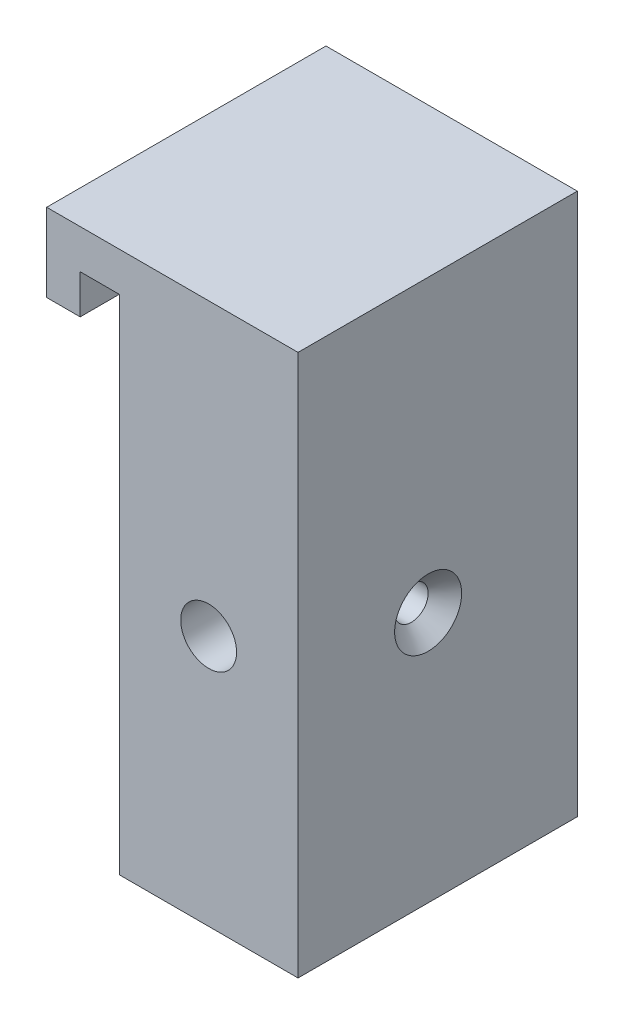
ISO-10303-21;
HEADER;
FILE_DESCRIPTION(('STEP AP214'),'2;1');
FILE_NAME('part.step','',(''),(''),'','','');
FILE_SCHEMA(('AUTOMOTIVE_DESIGN { 1 0 10303 214 1 1 1 1 }'));
ENDSEC;
DATA;
#1=APPLICATION_CONTEXT('core data for automotive mechanical design processes');
#2=APPLICATION_PROTOCOL_DEFINITION('international standard','automotive_design',2000,#1);
#3=PRODUCT_CONTEXT('',#1,'mechanical');
#4=PRODUCT('Part','Part','',(#3));
#5=PRODUCT_RELATED_PRODUCT_CATEGORY('part','',(#4));
#6=PRODUCT_DEFINITION_FORMATION('','',#4);
#7=PRODUCT_DEFINITION_CONTEXT('part definition',#1,'design');
#8=PRODUCT_DEFINITION('design','',#6,#7);
#9=PRODUCT_DEFINITION_SHAPE('','',#8);
#10=(LENGTH_UNIT() NAMED_UNIT(*) SI_UNIT(.MILLI.,.METRE.));
#11=(NAMED_UNIT(*) PLANE_ANGLE_UNIT() SI_UNIT($,.RADIAN.));
#12=(NAMED_UNIT(*) SI_UNIT($,.STERADIAN.) SOLID_ANGLE_UNIT());
#13=UNCERTAINTY_MEASURE_WITH_UNIT(LENGTH_MEASURE(1.E-05),#10,'distance_accuracy_value','');
#14=(GEOMETRIC_REPRESENTATION_CONTEXT(3) GLOBAL_UNCERTAINTY_ASSIGNED_CONTEXT((#13)) GLOBAL_UNIT_ASSIGNED_CONTEXT((#10,
#11,#12)) REPRESENTATION_CONTEXT('',''));
#15=CARTESIAN_POINT('',(0.,0.,0.));
#16=DIRECTION('',(0.,0.,1.));
#17=DIRECTION('',(1.,0.,0.));
#18=AXIS2_PLACEMENT_3D('',#15,#16,#17);
#19=CARTESIAN_POINT('',(0.,0.,50.));
#20=DIRECTION('',(0.,-1.,0.));
#21=DIRECTION('',(1.,0.,0.));
#22=AXIS2_PLACEMENT_3D('',#19,#20,#21);
#23=PLANE('',#22);
#24=DIRECTION('',(-1.,0.,0.));
#25=VECTOR('',#24,1.);
#26=CARTESIAN_POINT('',(0.,0.,0.));
#27=LINE('',#26,#25);
#28=CARTESIAN_POINT('',(0.,0.,0.));
#29=VERTEX_POINT('',#28);
#30=CARTESIAN_POINT('',(-45.,0.,0.));
#31=VERTEX_POINT('',#30);
#32=EDGE_CURVE('E159',#29,#31,#27,.T.);
#33=ORIENTED_EDGE('',*,*,#32,.T.);
#34=DIRECTION('',(0.,0.,-1.));
#35=VECTOR('',#34,1.);
#36=CARTESIAN_POINT('',(-45.,0.,50.));
#37=LINE('',#36,#35);
#38=CARTESIAN_POINT('',(-45.,0.,50.));
#39=VERTEX_POINT('',#38);
#40=EDGE_CURVE('E188',#39,#31,#37,.T.);
#41=ORIENTED_EDGE('',*,*,#40,.F.);
#42=DIRECTION('',(-1.,0.,0.));
#43=VECTOR('',#42,1.);
#44=CARTESIAN_POINT('',(0.,0.,50.));
#45=LINE('',#44,#43);
#46=CARTESIAN_POINT('',(0.,0.,50.));
#47=VERTEX_POINT('',#46);
#48=EDGE_CURVE('E175',#47,#39,#45,.T.);
#49=ORIENTED_EDGE('',*,*,#48,.F.);
#50=DIRECTION('',(0.,0.,-1.));
#51=VECTOR('',#50,1.);
#52=CARTESIAN_POINT('',(0.,0.,50.));
#53=LINE('',#52,#51);
#54=EDGE_CURVE('E155',#47,#29,#53,.T.);
#55=ORIENTED_EDGE('',*,*,#54,.T.);
#56=EDGE_LOOP('',(#33,#41,#49,#55));
#57=FACE_BOUND('',#56,.T.);
#58=ADVANCED_FACE('F50',(#57),#23,.F.);
#59=CARTESIAN_POINT('',(-45.,0.,50.));
#60=DIRECTION('',(1.,0.,0.));
#61=DIRECTION('',(0.,0.,-1.));
#62=AXIS2_PLACEMENT_3D('',#59,#60,#61);
#63=PLANE('',#62);
#64=DIRECTION('',(0.,-1.,0.));
#65=VECTOR('',#64,1.);
#66=CARTESIAN_POINT('',(-45.,0.,0.));
#67=LINE('',#66,#65);
#68=CARTESIAN_POINT('',(-45.,-14.,0.));
#69=VERTEX_POINT('',#68);
#70=EDGE_CURVE('E162',#31,#69,#67,.T.);
#71=ORIENTED_EDGE('',*,*,#70,.T.);
#72=DIRECTION('',(0.,0.,-1.));
#73=VECTOR('',#72,1.);
#74=CARTESIAN_POINT('',(-45.,-14.,50.));
#75=LINE('',#74,#73);
#76=CARTESIAN_POINT('',(-45.,-14.,50.));
#77=VERTEX_POINT('',#76);
#78=EDGE_CURVE('E185',#77,#69,#75,.T.);
#79=ORIENTED_EDGE('',*,*,#78,.F.);
#80=DIRECTION('',(0.,-1.,0.));
#81=VECTOR('',#80,1.);
#82=CARTESIAN_POINT('',(-45.,0.,50.));
#83=LINE('',#82,#81);
#84=EDGE_CURVE('E116',#39,#77,#83,.T.);
#85=ORIENTED_EDGE('',*,*,#84,.F.);
#86=ORIENTED_EDGE('',*,*,#40,.T.);
#87=EDGE_LOOP('',(#71,#79,#85,#86));
#88=FACE_BOUND('',#87,.T.);
#89=ADVANCED_FACE('F205',(#88),#63,.F.);
#90=CARTESIAN_POINT('',(-45.,-14.,50.));
#91=DIRECTION('',(0.,1.,0.));
#92=DIRECTION('',(0.,0.,1.));
#93=AXIS2_PLACEMENT_3D('',#90,#91,#92);
#94=PLANE('',#93);
#95=DIRECTION('',(1.,0.,0.));
#96=VECTOR('',#95,1.);
#97=CARTESIAN_POINT('',(-45.,-14.,0.));
#98=LINE('',#97,#96);
#99=CARTESIAN_POINT('',(-39.,-14.,0.));
#100=VERTEX_POINT('',#99);
#101=EDGE_CURVE('E165',#69,#100,#98,.T.);
#102=ORIENTED_EDGE('',*,*,#101,.T.);
#103=DIRECTION('',(0.,0.,-1.));
#104=VECTOR('',#103,1.);
#105=CARTESIAN_POINT('',(-39.,-14.,50.));
#106=LINE('',#105,#104);
#107=CARTESIAN_POINT('',(-39.,-14.,50.));
#108=VERTEX_POINT('',#107);
#109=EDGE_CURVE('E182',#108,#100,#106,.T.);
#110=ORIENTED_EDGE('',*,*,#109,.F.);
#111=DIRECTION('',(1.,0.,0.));
#112=VECTOR('',#111,1.);
#113=CARTESIAN_POINT('',(-45.,-14.,50.));
#114=LINE('',#113,#112);
#115=EDGE_CURVE('E258',#77,#108,#114,.T.);
#116=ORIENTED_EDGE('',*,*,#115,.F.);
#117=ORIENTED_EDGE('',*,*,#78,.T.);
#118=EDGE_LOOP('',(#102,#110,#116,#117));
#119=FACE_BOUND('',#118,.T.);
#120=ADVANCED_FACE('F209',(#119),#94,.F.);
#121=CARTESIAN_POINT('',(-39.,-14.,50.));
#122=DIRECTION('',(-1.,0.,0.));
#123=DIRECTION('',(0.,0.,1.));
#124=AXIS2_PLACEMENT_3D('',#121,#122,#123);
#125=PLANE('',#124);
#126=DIRECTION('',(0.,1.,0.));
#127=VECTOR('',#126,1.);
#128=CARTESIAN_POINT('',(-39.,-14.,0.));
#129=LINE('',#128,#127);
#130=CARTESIAN_POINT('',(-39.,-7.,0.));
#131=VERTEX_POINT('',#130);
#132=EDGE_CURVE('E167',#100,#131,#129,.T.);
#133=ORIENTED_EDGE('',*,*,#132,.T.);
#134=DIRECTION('',(0.,0.,-1.));
#135=VECTOR('',#134,1.);
#136=CARTESIAN_POINT('',(-39.,-7.,50.));
#137=LINE('',#136,#135);
#138=CARTESIAN_POINT('',(-39.,-7.,50.));
#139=VERTEX_POINT('',#138);
#140=EDGE_CURVE('E179',#139,#131,#137,.T.);
#141=ORIENTED_EDGE('',*,*,#140,.F.);
#142=DIRECTION('',(0.,1.,0.));
#143=VECTOR('',#142,1.);
#144=CARTESIAN_POINT('',(-39.,-14.,50.));
#145=LINE('',#144,#143);
#146=EDGE_CURVE('E260',#108,#139,#145,.T.);
#147=ORIENTED_EDGE('',*,*,#146,.F.);
#148=ORIENTED_EDGE('',*,*,#109,.T.);
#149=EDGE_LOOP('',(#133,#141,#147,#148));
#150=FACE_BOUND('',#149,.T.);
#151=ADVANCED_FACE('F212',(#150),#125,.F.);
#152=CARTESIAN_POINT('',(-39.,-7.,50.));
#153=DIRECTION('',(0.,1.,0.));
#154=DIRECTION('',(-1.,0.,0.));
#155=AXIS2_PLACEMENT_3D('',#152,#153,#154);
#156=PLANE('',#155);
#157=DIRECTION('',(1.,0.,0.));
#158=VECTOR('',#157,1.);
#159=CARTESIAN_POINT('',(-39.,-7.,0.));
#160=LINE('',#159,#158);
#161=CARTESIAN_POINT('',(-32.,-7.,0.));
#162=VERTEX_POINT('',#161);
#163=EDGE_CURVE('E169',#131,#162,#160,.T.);
#164=ORIENTED_EDGE('',*,*,#163,.T.);
#165=DIRECTION('',(0.,0.,-1.));
#166=VECTOR('',#165,1.);
#167=CARTESIAN_POINT('',(-32.,-7.,50.));
#168=LINE('',#167,#166);
#169=CARTESIAN_POINT('',(-32.,-7.,50.));
#170=VERTEX_POINT('',#169);
#171=EDGE_CURVE('E150',#170,#162,#168,.T.);
#172=ORIENTED_EDGE('',*,*,#171,.F.);
#173=DIRECTION('',(1.,0.,0.));
#174=VECTOR('',#173,1.);
#175=CARTESIAN_POINT('',(-39.,-7.,50.));
#176=LINE('',#175,#174);
#177=EDGE_CURVE('E138',#139,#170,#176,.T.);
#178=ORIENTED_EDGE('',*,*,#177,.F.);
#179=ORIENTED_EDGE('',*,*,#140,.T.);
#180=EDGE_LOOP('',(#164,#172,#178,#179));
#181=FACE_BOUND('',#180,.T.);
#182=ADVANCED_FACE('F216',(#181),#156,.F.);
#183=CARTESIAN_POINT('',(-32.,-7.,50.));
#184=DIRECTION('',(1.,0.,0.));
#185=DIRECTION('',(0.,1.,0.));
#186=AXIS2_PLACEMENT_3D('',#183,#184,#185);
#187=PLANE('',#186);
#188=DIRECTION('',(0.,-1.,0.));
#189=VECTOR('',#188,1.);
#190=CARTESIAN_POINT('',(-32.,-7.,0.));
#191=LINE('',#190,#189);
#192=CARTESIAN_POINT('',(-32.,-97.,0.));
#193=VERTEX_POINT('',#192);
#194=EDGE_CURVE('E147',#162,#193,#191,.T.);
#195=ORIENTED_EDGE('',*,*,#194,.T.);
#196=DIRECTION('',(0.,0.,-1.));
#197=VECTOR('',#196,1.);
#198=CARTESIAN_POINT('',(-32.,-97.,50.));
#199=LINE('',#198,#197);
#200=CARTESIAN_POINT('',(-32.,-97.,50.));
#201=VERTEX_POINT('',#200);
#202=EDGE_CURVE('E144',#201,#193,#199,.T.);
#203=ORIENTED_EDGE('',*,*,#202,.F.);
#204=DIRECTION('',(0.,-1.,0.));
#205=VECTOR('',#204,1.);
#206=CARTESIAN_POINT('',(-32.,-7.,50.));
#207=LINE('',#206,#205);
#208=EDGE_CURVE('E131',#170,#201,#207,.T.);
#209=ORIENTED_EDGE('',*,*,#208,.F.);
#210=ORIENTED_EDGE('',*,*,#171,.T.);
#211=EDGE_LOOP('',(#195,#203,#209,#210));
#212=FACE_BOUND('',#211,.T.);
#213=ADVANCED_FACE('F145',(#212),#187,.F.);
#214=CARTESIAN_POINT('',(-32.,-97.,50.));
#215=DIRECTION('',(0.,1.,0.));
#216=DIRECTION('',(0.,0.,1.));
#217=AXIS2_PLACEMENT_3D('',#214,#215,#216);
#218=PLANE('',#217);
#219=CARTESIAN_POINT('',(-7.,-97.,25.));
#220=DIRECTION('',(0.,-1.,0.));
#221=DIRECTION('',(0.,0.,-1.));
#222=AXIS2_PLACEMENT_3D('',#219,#220,#221);
#223=CIRCLE('',#222,4.);
#224=CARTESIAN_POINT('',(-7.,-97.,21.));
#225=VERTEX_POINT('',#224);
#226=EDGE_CURVE('E308',#225,#225,#223,.T.);
#227=ORIENTED_EDGE('',*,*,#226,.F.);
#228=EDGE_LOOP('',(#227));
#229=FACE_BOUND('',#228,.T.);
#230=CARTESIAN_POINT('',(-25.,-97.,25.));
#231=DIRECTION('',(0.,-1.,0.));
#232=DIRECTION('',(0.,0.,-1.));
#233=AXIS2_PLACEMENT_3D('',#230,#231,#232);
#234=CIRCLE('',#233,4.);
#235=CARTESIAN_POINT('',(-25.,-97.,21.));
#236=VERTEX_POINT('',#235);
#237=EDGE_CURVE('E310',#236,#236,#234,.T.);
#238=ORIENTED_EDGE('',*,*,#237,.F.);
#239=EDGE_LOOP('',(#238));
#240=FACE_BOUND('',#239,.T.);
#241=DIRECTION('',(1.,0.,0.));
#242=VECTOR('',#241,1.);
#243=CARTESIAN_POINT('',(-32.,-97.,0.));
#244=LINE('',#243,#242);
#245=CARTESIAN_POINT('',(0.,-97.,0.));
#246=VERTEX_POINT('',#245);
#247=EDGE_CURVE('E172',#193,#246,#244,.T.);
#248=ORIENTED_EDGE('',*,*,#247,.T.);
#249=DIRECTION('',(0.,0.,-1.));
#250=VECTOR('',#249,1.);
#251=CARTESIAN_POINT('',(0.,-97.,50.));
#252=LINE('',#251,#250);
#253=CARTESIAN_POINT('',(0.,-97.,50.));
#254=VERTEX_POINT('',#253);
#255=EDGE_CURVE('E151',#254,#246,#252,.T.);
#256=ORIENTED_EDGE('',*,*,#255,.F.);
#257=DIRECTION('',(1.,0.,0.));
#258=VECTOR('',#257,1.);
#259=CARTESIAN_POINT('',(-32.,-97.,50.));
#260=LINE('',#259,#258);
#261=EDGE_CURVE('E135',#201,#254,#260,.T.);
#262=ORIENTED_EDGE('',*,*,#261,.F.);
#263=ORIENTED_EDGE('',*,*,#202,.T.);
#264=EDGE_LOOP('',(#248,#256,#262,#263));
#265=FACE_BOUND('',#264,.T.);
#266=ADVANCED_FACE('F153',(#229,#240,#265),#218,.F.);
#267=CARTESIAN_POINT('',(0.,-97.,50.));
#268=DIRECTION('',(-1.,0.,0.));
#269=DIRECTION('',(0.,0.,1.));
#270=AXIS2_PLACEMENT_3D('',#267,#268,#269);
#271=PLANE('',#270);
#272=CARTESIAN_POINT('',(0.,-52.,26.7076233728293));
#273=DIRECTION('',(-1.,0.,0.));
#274=DIRECTION('',(0.,0.,1.));
#275=AXIS2_PLACEMENT_3D('',#272,#273,#274);
#276=CIRCLE('',#275,6.00000000000003);
#277=CARTESIAN_POINT('',(0.,-52.,20.7076233728293));
#278=VERTEX_POINT('',#277);
#279=EDGE_CURVE('E13',#278,#278,#276,.T.);
#280=ORIENTED_EDGE('',*,*,#279,.T.);
#281=EDGE_LOOP('',(#280));
#282=FACE_BOUND('',#281,.T.);
#283=DIRECTION('',(0.,1.,0.));
#284=VECTOR('',#283,1.);
#285=CARTESIAN_POINT('',(0.,-97.,0.));
#286=LINE('',#285,#284);
#287=EDGE_CURVE('E107',#246,#29,#286,.T.);
#288=ORIENTED_EDGE('',*,*,#287,.T.);
#289=ORIENTED_EDGE('',*,*,#54,.F.);
#290=DIRECTION('',(0.,1.,0.));
#291=VECTOR('',#290,1.);
#292=CARTESIAN_POINT('',(0.,-97.,50.));
#293=LINE('',#292,#291);
#294=EDGE_CURVE('E74',#254,#47,#293,.T.);
#295=ORIENTED_EDGE('',*,*,#294,.F.);
#296=ORIENTED_EDGE('',*,*,#255,.T.);
#297=EDGE_LOOP('',(#288,#289,#295,#296));
#298=FACE_BOUND('',#297,.T.);
#299=ADVANCED_FACE('F225',(#282,#298),#271,.F.);
#300=CARTESIAN_POINT('',(0.,0.,50.));
#301=DIRECTION('',(0.,0.,1.));
#302=DIRECTION('',(1.,0.,0.));
#303=AXIS2_PLACEMENT_3D('',#300,#301,#302);
#304=PLANE('',#303);
#305=CARTESIAN_POINT('',(-16.,-52.,50.));
#306=DIRECTION('',(0.,0.,1.));
#307=DIRECTION('',(1.,0.,0.));
#308=AXIS2_PLACEMENT_3D('',#305,#306,#307);
#309=CIRCLE('',#308,5.);
#310=CARTESIAN_POINT('',(-11.,-52.,50.));
#311=VERTEX_POINT('',#310);
#312=EDGE_CURVE('E252',#311,#311,#309,.T.);
#313=ORIENTED_EDGE('',*,*,#312,.F.);
#314=EDGE_LOOP('',(#313));
#315=FACE_BOUND('',#314,.T.);
#316=ORIENTED_EDGE('',*,*,#48,.T.);
#317=ORIENTED_EDGE('',*,*,#84,.T.);
#318=ORIENTED_EDGE('',*,*,#115,.T.);
#319=ORIENTED_EDGE('',*,*,#146,.T.);
#320=ORIENTED_EDGE('',*,*,#177,.T.);
#321=ORIENTED_EDGE('',*,*,#208,.T.);
#322=ORIENTED_EDGE('',*,*,#261,.T.);
#323=ORIENTED_EDGE('',*,*,#294,.T.);
#324=EDGE_LOOP('',(#316,#317,#318,#319,#320,#321,#322,#323));
#325=FACE_BOUND('',#324,.T.);
#326=ADVANCED_FACE('F133',(#315,#325),#304,.T.);
#327=CARTESIAN_POINT('',(0.,0.,0.));
#328=DIRECTION('',(0.,0.,1.));
#329=DIRECTION('',(1.,0.,0.));
#330=AXIS2_PLACEMENT_3D('',#327,#328,#329);
#331=PLANE('',#330);
#332=ORIENTED_EDGE('',*,*,#32,.F.);
#333=ORIENTED_EDGE('',*,*,#287,.F.);
#334=ORIENTED_EDGE('',*,*,#247,.F.);
#335=ORIENTED_EDGE('',*,*,#194,.F.);
#336=ORIENTED_EDGE('',*,*,#163,.F.);
#337=ORIENTED_EDGE('',*,*,#132,.F.);
#338=ORIENTED_EDGE('',*,*,#101,.F.);
#339=ORIENTED_EDGE('',*,*,#70,.F.);
#340=EDGE_LOOP('',(#332,#333,#334,#335,#336,#337,#338,#339));
#341=FACE_BOUND('',#340,.T.);
#342=ADVANCED_FACE('F230',(#341),#331,.F.);
#343=CARTESIAN_POINT('',(-16.,-52.,25.));
#344=DIRECTION('',(0.,0.,1.));
#345=DIRECTION('',(1.,0.,0.));
#346=AXIS2_PLACEMENT_3D('',#343,#344,#345);
#347=CONICAL_SURFACE('',#346,4.99999999999999,1.02974425867665);
#348=CARTESIAN_POINT('',(-16.,-52.,21.9956969048622));
#349=VERTEX_POINT('',#348);
#350=VERTEX_LOOP('',#349);
#351=FACE_BOUND('',#350,.T.);
#352=CARTESIAN_POINT('',(-16.,-52.,25.));
#353=DIRECTION('',(0.,0.,1.));
#354=DIRECTION('',(1.,0.,0.));
#355=AXIS2_PLACEMENT_3D('',#352,#353,#354);
#356=CIRCLE('',#355,4.99999999999999);
#357=CARTESIAN_POINT('',(-11.6507497676688,-49.5334188810082,25.));
#358=VERTEX_POINT('',#357);
#359=CARTESIAN_POINT('',(-11.6507497676688,-54.4665811189918,25.));
#360=VERTEX_POINT('',#359);
#361=EDGE_CURVE('E163',#358,#360,#356,.T.);
#362=ORIENTED_EDGE('',*,*,#361,.T.);
#363=EDGE_CURVE('E250',#360,#358,#356,.T.);
#364=ORIENTED_EDGE('',*,*,#363,.T.);
#365=EDGE_LOOP('',(#362,#364));
#366=FACE_BOUND('',#365,.T.);
#367=ADVANCED_FACE('F233',(#351,#366),#347,.F.);
#368=CARTESIAN_POINT('',(-16.,-52.,50.));
#369=DIRECTION('',(0.,0.,1.));
#370=DIRECTION('',(1.,0.,0.));
#371=AXIS2_PLACEMENT_3D('',#368,#369,#370);
#372=CYLINDRICAL_SURFACE('',#371,5.);
#373=ORIENTED_EDGE('',*,*,#361,.F.);
#374=CARTESIAN_POINT('',(-11.6507497676688,-49.5334188810082,25.));
#375=CARTESIAN_POINT('',(-11.6750867267925,-49.4905027575428,25.0620133161696));
#376=CARTESIAN_POINT('',(-11.6989841717827,-49.449848895624,25.1257142269941));
#377=CARTESIAN_POINT('',(-11.7453532608035,-49.3732178397698,25.2564875039548));
#378=CARTESIAN_POINT('',(-11.7678229412446,-49.3372470180274,25.3235642951655));
#379=CARTESIAN_POINT('',(-11.8324448172559,-49.2363238097742,25.53047452642));
#380=CARTESIAN_POINT('',(-11.8714826904178,-49.1789167821243,25.6751904940512));
#381=CARTESIAN_POINT('',(-11.9199484354826,-49.1096751919386,25.9000012130033));
#382=CARTESIAN_POINT('',(-11.9344554711276,-49.0893640473525,25.9765157488115));
#383=CARTESIAN_POINT('',(-11.959450008169,-49.0547644012733,26.1315323182649));
#384=CARTESIAN_POINT('',(-11.9699394667519,-49.0404729669031,26.2100333642487));
#385=CARTESIAN_POINT('',(-11.9863811753609,-49.018212165248,26.3680886875101));
#386=CARTESIAN_POINT('',(-11.9923508873382,-49.0102184618932,26.4476376906824));
#387=CARTESIAN_POINT('',(-11.9995396171048,-49.0006094486203,26.6073068493814));
#388=CARTESIAN_POINT('',(-12.0007593255797,-48.9989932113711,26.6874269201732));
#389=CARTESIAN_POINT('',(-11.9974297637971,-49.0034173131058,26.9082290374623));
#390=CARTESIAN_POINT('',(-11.98780684653,-49.0161899162756,27.0487832685568));
#391=CARTESIAN_POINT('',(-11.954946952036,-49.0609067832329,27.325221384542));
#392=CARTESIAN_POINT('',(-11.93168946879,-49.0928799258812,27.4610979077089));
#393=CARTESIAN_POINT('',(-11.8746834377847,-49.1743654911033,27.7248901795378));
#394=CARTESIAN_POINT('',(-11.8409470475152,-49.2238575976482,27.8528149483642));
#395=CARTESIAN_POINT('',(-11.7665289407489,-49.3387219908646,28.0990553948735));
#396=CARTESIAN_POINT('',(-11.7258463858458,-49.4040961949181,28.2173699100459));
#397=CARTESIAN_POINT('',(-11.6329017034288,-49.5631104915136,28.4646228719171));
#398=CARTESIAN_POINT('',(-11.579902547867,-49.6597559833567,28.5913583335898));
#399=CARTESIAN_POINT('',(-11.4739399723174,-49.8718811800205,28.8281028993904));
#400=CARTESIAN_POINT('',(-11.4209766446387,-49.9873800880878,28.9380947261088));
#401=CARTESIAN_POINT('',(-11.3139183657895,-50.2499029611704,29.1507234157347));
#402=CARTESIAN_POINT('',(-11.2603757220414,-50.3990163810586,29.2511131199019));
#403=CARTESIAN_POINT('',(-11.1888514436642,-50.6362821294403,29.3812804417724));
#404=CARTESIAN_POINT('',(-11.1664694281417,-50.7176638050893,29.4212758452825));
#405=CARTESIAN_POINT('',(-11.12527652214,-50.8844614410712,29.4939887808833));
#406=CARTESIAN_POINT('',(-11.106463309458,-50.9698747325457,29.5267110479661));
#407=CARTESIAN_POINT('',(-11.0744606066898,-51.1365035765334,29.5818879309118));
#408=CARTESIAN_POINT('',(-11.0609246677109,-51.2174397293731,29.6049873446623));
#409=CARTESIAN_POINT('',(-11.0377166134726,-51.381455161871,29.6443749704833));
#410=CARTESIAN_POINT('',(-11.0280423376556,-51.4645332153808,29.6606669914539));
#411=CARTESIAN_POINT('',(-11.0128446567638,-51.6321018711165,29.6861842458552));
#412=CARTESIAN_POINT('',(-11.0073188431339,-51.7165916245476,29.6954135798707));
#413=CARTESIAN_POINT('',(-11.0005733534901,-51.8861910019406,29.7066702568887));
#414=CARTESIAN_POINT('',(-10.9993531924111,-51.9713005549947,29.70869841116));
#415=CARTESIAN_POINT('',(-11.0019977861276,-52.2045368289796,29.7042988286731));
#416=CARTESIAN_POINT('',(-11.0103076106767,-52.3525614129985,29.6904797174791));
#417=CARTESIAN_POINT('',(-11.039437523073,-52.6436454453205,29.6414867191253));
#418=CARTESIAN_POINT('',(-11.0602582531447,-52.7867046383356,29.6063117356999));
#419=CARTESIAN_POINT('',(-11.1124957387225,-53.0640346694804,29.5163656159244));
#420=CARTESIAN_POINT('',(-11.1438874914592,-53.1983253604297,29.4616407009993));
#421=CARTESIAN_POINT('',(-11.2147964211751,-53.4559210713711,29.3345888445465));
#422=CARTESIAN_POINT('',(-11.254315544351,-53.5792234499241,29.2622576862288));
#423=CARTESIAN_POINT('',(-11.3435505182529,-53.8266658604981,29.0926436750185));
#424=CARTESIAN_POINT('',(-11.3939170118974,-53.949254743516,28.9934429198949));
#425=CARTESIAN_POINT('',(-11.4971059042812,-54.1770676638993,28.777657758299));
#426=CARTESIAN_POINT('',(-11.5499314524741,-54.2822686009621,28.6610506120297));
#427=CARTESIAN_POINT('',(-11.6596644692555,-54.4852215977049,28.3971892633909));
#428=CARTESIAN_POINT('',(-11.7162955120245,-54.5805437582356,28.2479348886089));
#429=CARTESIAN_POINT('',(-11.8193803335486,-54.7444178805101,27.9322320910251));
#430=CARTESIAN_POINT('',(-11.8658504710051,-54.813013013182,27.7658119499389));
#431=CARTESIAN_POINT('',(-11.9316391760254,-54.9070447265317,27.4612943764703));
#432=CARTESIAN_POINT('',(-11.9547998230334,-54.9388933184621,27.3260108054174));
#433=CARTESIAN_POINT('',(-11.9876187928505,-54.9835539932448,27.0508065169439));
#434=CARTESIAN_POINT('',(-11.9972947150792,-54.9963908903478,26.9108920881957));
#435=CARTESIAN_POINT('',(-12.0017165985996,-55.0022906367085,26.6301322901836));
#436=CARTESIAN_POINT('',(-11.9964336733959,-54.9953152270483,26.4892856444423));
#437=CARTESIAN_POINT('',(-11.9716919499057,-54.9619487377003,26.2111141862152));
#438=CARTESIAN_POINT('',(-11.9522189070851,-54.9355381480393,26.0737930562682));
#439=CARTESIAN_POINT('',(-11.902156586449,-54.8652206410279,25.8080912250924));
#440=CARTESIAN_POINT('',(-11.8717277514946,-54.8215654106862,25.6796118374272));
#441=CARTESIAN_POINT('',(-11.8030896656156,-54.7184106739796,25.4315808779688));
#442=CARTESIAN_POINT('',(-11.7648855243266,-54.6589215651752,25.3120235131195));
#443=CARTESIAN_POINT('',(-11.7005454999535,-54.5528084212674,25.129872762807));
#444=CARTESIAN_POINT('',(-11.6758678716446,-54.5108802111856,25.0639879078286));
#445=CARTESIAN_POINT('',(-11.6507497676688,-54.4665811189918,25.));
#446=B_SPLINE_CURVE_WITH_KNOTS('',3,(#374,#375,#376,#377,#378,#379,#380,#381,#382,#383,#384,
#385,#386,#387,#388,#389,#390,#391,#392,#393,#394,#395,#396,#397,#398,#399,#400,#401,#402,#403,
#404,#405,#406,#407,#408,#409,#410,#411,#412,#413,#414,#415,#416,#417,#418,#419,#420,#421,#422,
#423,#424,#425,#426,#427,#428,#429,#430,#431,#432,#433,#434,#435,#436,#437,#438,#439,#440,#441,
#442,#443,#444,#445),.UNSPECIFIED.,.F.,.F.,(4,2,2,2,2,2,2,2,2,2,2,2,2,2,2,2,2,2,2,2,2,2,2,2,2,2,
2,2,2,2,2,2,2,2,2,4),(0.,0.237594101313884,0.475508190185764,0.954383400091294,1.19555527031082,
1.4366095023247,1.67672760567656,1.91681079277953,2.33887579244407,2.76157720087811,
3.1837900170124,3.6060538305585,4.10793444091819,4.61032947126643,5.16967524330391,
5.4495205326875,5.72918309872965,5.98456466268595,6.23980314254595,6.49489331868173,
6.74995475601558,7.19428233676359,7.63863272820551,8.08193943112396,8.52535241303325,
9.02002790444858,9.51535539169779,10.0704417688373,10.6246277864916,11.0455353860846,
11.4658931272987,11.8870631595993,12.3086565604809,12.7243115476648,13.13969425912,
13.3851130249825),.UNSPECIFIED.);
#447=EDGE_CURVE('E190',#358,#360,#446,.T.);
#448=ORIENTED_EDGE('',*,*,#447,.T.);
#449=EDGE_LOOP('',(#373,#448));
#450=FACE_BOUND('',#449,.T.);
#451=ORIENTED_EDGE('',*,*,#312,.T.);
#452=EDGE_LOOP('',(#451));
#453=FACE_BOUND('',#452,.T.);
#454=ADVANCED_FACE('F197',(#450,#453),#372,.F.);
#455=CARTESIAN_POINT('',(0.,-52.,26.7076233728293));
#456=DIRECTION('',(1.,0.,0.));
#457=DIRECTION('',(0.,0.,-1.));
#458=AXIS2_PLACEMENT_3D('',#455,#456,#457);
#459=CYLINDRICAL_SURFACE('',#458,3.);
#460=CARTESIAN_POINT('',(-3.00000000000003,-52.,26.7076233728293));
#461=DIRECTION('',(-1.,0.,0.));
#462=DIRECTION('',(0.,0.,1.));
#463=AXIS2_PLACEMENT_3D('',#460,#461,#462);
#464=CIRCLE('',#463,3.);
#465=CARTESIAN_POINT('',(-3.00000000000003,-52.,23.7076233728293));
#466=VERTEX_POINT('',#465);
#467=EDGE_CURVE('E59',#466,#466,#464,.F.);
#468=ORIENTED_EDGE('',*,*,#467,.T.);
#469=EDGE_LOOP('',(#468));
#470=FACE_BOUND('',#469,.T.);
#471=CARTESIAN_POINT('',(-11.,-52.,23.7076233728293));
#472=CARTESIAN_POINT('',(-11.0000009245362,-52.0767697294352,23.7076244290739));
#473=CARTESIAN_POINT('',(-11.0017743218773,-52.1535621345184,23.7105769663994));
#474=CARTESIAN_POINT('',(-11.0088163742937,-52.3065484877587,23.7223376058091));
#475=CARTESIAN_POINT('',(-11.0140870744604,-52.3827420593466,23.7311491340176));
#476=CARTESIAN_POINT('',(-11.0350065464745,-52.6098081300246,23.7662719322925));
#477=CARTESIAN_POINT('',(-11.0557622742867,-52.7589818632917,23.8012710752628));
#478=CARTESIAN_POINT('',(-11.108767610041,-53.0475416736358,23.8923961163335));
#479=CARTESIAN_POINT('',(-11.1409602044889,-53.1869722674134,23.9484172948421));
#480=CARTESIAN_POINT('',(-11.2140929774422,-53.4540504280022,24.0793440334264));
#481=CARTESIAN_POINT('',(-11.255030983853,-53.5817009093826,24.1542449051895));
#482=CARTESIAN_POINT('',(-11.3458926871663,-53.8326016038182,24.3271730279445));
#483=CARTESIAN_POINT('',(-11.3962641295811,-53.9547688598617,24.4265307639959));
#484=CARTESIAN_POINT('',(-11.4993912409408,-54.1817645874806,24.6425577800215));
#485=CARTESIAN_POINT('',(-11.5521499044246,-54.286570467504,24.7592492470477));
#486=CARTESIAN_POINT('',(-11.6617786516666,-54.4889001950984,25.0234703939982));
#487=CARTESIAN_POINT('',(-11.718359643642,-54.5839553962784,25.1730269149515));
#488=CARTESIAN_POINT('',(-11.8212339740388,-54.7472286867078,25.4893165191562));
#489=CARTESIAN_POINT('',(-11.8675439552511,-54.8154903315581,25.6560211648625));
#490=CARTESIAN_POINT('',(-11.9329074062278,-54.9088120457722,25.9608162744862));
#491=CARTESIAN_POINT('',(-11.9558423366136,-54.9403239458764,26.0960953711907));
#492=CARTESIAN_POINT('',(-11.9881938347238,-54.9843234458708,26.3712308033507));
#493=CARTESIAN_POINT('',(-11.9976272091063,-54.9968346988436,26.5110812261334));
#494=CARTESIAN_POINT('',(-12.0015815487375,-55.0021101681982,26.7916463654772));
#495=CARTESIAN_POINT('',(-11.9960732524326,-54.9948356363078,26.9323622387412));
#496=CARTESIAN_POINT('',(-11.9709347784437,-54.9609212414611,27.2101809079472));
#497=CARTESIAN_POINT('',(-11.9512939786523,-54.9342668122544,27.3472809057708));
#498=CARTESIAN_POINT('',(-11.9009362341707,-54.8634783193319,27.6126839150799));
#499=CARTESIAN_POINT('',(-11.8703656669996,-54.8195745342289,27.7410776958238));
#500=CARTESIAN_POINT('',(-11.8014590729697,-54.7159016746707,27.9890131394611));
#501=CARTESIAN_POINT('',(-11.7631202005854,-54.6561267841416,28.1085515366584));
#502=CARTESIAN_POINT('',(-11.6748930163444,-54.5103577382067,28.3575925104857));
#503=CARTESIAN_POINT('',(-11.6241573641925,-54.4216067190187,28.4851833651971));
#504=CARTESIAN_POINT('',(-11.5213897747585,-54.2258296320778,28.7249725300495));
#505=CARTESIAN_POINT('',(-11.4693566392235,-54.118786093355,28.8371559382315));
#506=CARTESIAN_POINT('',(-11.3612823303709,-53.8715904092136,29.0588656322778));
#507=CARTESIAN_POINT('',(-11.3056931804693,-53.7289031517877,29.1658427640667));
#508=CARTESIAN_POINT('',(-11.2298167400495,-53.5006105363028,29.3068920855522));
#509=CARTESIAN_POINT('',(-11.2057668476253,-53.4220982181568,29.3506875083454));
#510=CARTESIAN_POINT('',(-11.1608350324357,-53.2607436867391,29.4313421964403));
#511=CARTESIAN_POINT('',(-11.1399511641104,-53.1779041750117,29.4682057248501));
#512=CARTESIAN_POINT('',(-11.1031732725507,-53.01376371174,29.532434815686));
#513=CARTESIAN_POINT('',(-11.0870489954505,-52.932690066664,29.5602499332785));
#514=CARTESIAN_POINT('',(-11.0586087320526,-52.7678799497328,29.6089573286746));
#515=CARTESIAN_POINT('',(-11.0462906144672,-52.6841449971746,29.6298534812757));
#516=CARTESIAN_POINT('',(-11.0258362948511,-52.5147444626544,29.6643952275541));
#517=CARTESIAN_POINT('',(-11.0176970317913,-52.4290803419696,29.6780461286579));
#518=CARTESIAN_POINT('',(-11.0058400358559,-52.2566217465922,29.6978895572195));
#519=CARTESIAN_POINT('',(-11.002121681103,-52.1698274326178,29.7040831336807));
#520=CARTESIAN_POINT('',(-10.9982084204521,-51.9326757428894,29.710616043113));
#521=CARTESIAN_POINT('',(-11.0025348742816,-51.7819431573893,29.7034349184599));
#522=CARTESIAN_POINT('',(-11.0244204497993,-51.484313092371,29.6667778311002));
#523=CARTESIAN_POINT('',(-11.0419793031559,-51.337415535147,29.6373023204875));
#524=CARTESIAN_POINT('',(-11.0881055234431,-51.0548574007452,29.5585349136451));
#525=CARTESIAN_POINT('',(-11.1163948557027,-50.9190104514306,29.5097422462373));
#526=CARTESIAN_POINT('',(-11.1817220137165,-50.6574665481525,29.3942690486284));
#527=CARTESIAN_POINT('',(-11.2187615648464,-50.5317716025372,29.3275849902353));
#528=CARTESIAN_POINT('',(-11.3030901894072,-50.2799880786985,29.1705092818514));
#529=CARTESIAN_POINT('',(-11.3510439759305,-50.1552118617578,29.0783756789919));
#530=CARTESIAN_POINT('',(-11.4505146577413,-49.9219477745178,28.8768406215746));
#531=CARTESIAN_POINT('',(-11.5020356595664,-49.8134791484584,28.7674190732266));
#532=CARTESIAN_POINT('',(-11.6110915316432,-49.6013601173584,28.5178025813362));
#533=CARTESIAN_POINT('',(-11.6685351676985,-49.5001796211583,28.3754555988863));
#534=CARTESIAN_POINT('',(-11.7756763560443,-49.3230952079247,28.0731913267018));
#535=CARTESIAN_POINT('',(-11.8253820393859,-49.2471646615454,27.9132927856781));
#536=CARTESIAN_POINT('',(-11.9003018157073,-49.1371484264829,27.6151373277186));
#537=CARTESIAN_POINT('',(-11.9284868136611,-49.0975674933739,27.4796627481873));
#538=CARTESIAN_POINT('',(-11.9718078848938,-49.037726721783,27.2025592165941));
#539=CARTESIAN_POINT('',(-11.986962046721,-49.0174400960493,27.0609390833778));
#540=CARTESIAN_POINT('',(-12.0019910681008,-48.997317389658,26.7748694784341));
#541=CARTESIAN_POINT('',(-12.0018084725518,-48.9975582096916,26.630411394581));
#542=CARTESIAN_POINT('',(-11.9860456406716,-49.018670548969,26.3438344984829));
#543=CARTESIAN_POINT('',(-11.9704570317631,-49.0395532863041,26.2017170009545));
#544=CARTESIAN_POINT('',(-11.9273363003378,-49.0991964878777,25.9306465488342));
#545=CARTESIAN_POINT('',(-11.9004157828443,-49.1370471567135,25.801389224905));
#546=CARTESIAN_POINT('',(-11.8378899418339,-49.2287352648797,25.5509488231762));
#547=CARTESIAN_POINT('',(-11.8022813485252,-49.2825787248228,25.4297688072163));
#548=CARTESIAN_POINT('',(-11.7197402704963,-49.414214631403,25.1789838333694));
#549=CARTESIAN_POINT('',(-11.6719085742031,-49.4944148176844,25.0509418646146));
#550=CARTESIAN_POINT('',(-11.5735971332595,-49.6724878625304,24.8088625275227));
#551=CARTESIAN_POINT('',(-11.5231152325091,-49.7703752738793,24.6948368223498));
#552=CARTESIAN_POINT('',(-11.4154876172964,-49.9997964644744,24.4649245294999));
#553=CARTESIAN_POINT('',(-11.3585995426137,-50.1342142820949,24.3517734929677));
#554=CARTESIAN_POINT('',(-11.2526857046204,-50.4231072218656,24.1494153867812));
#555=CARTESIAN_POINT('',(-11.2036627621047,-50.5775895042633,24.0602168999096));
#556=CARTESIAN_POINT('',(-11.140794416851,-50.8189781033832,23.9484988986388));
#557=CARTESIAN_POINT('',(-11.1218286081465,-50.8997498571487,23.9152873768648));
#558=CARTESIAN_POINT('',(-11.087565862248,-51.0645577820116,23.8558512346859));
#559=CARTESIAN_POINT('',(-11.0722667846348,-51.1485920152119,23.8296225371284));
#560=CARTESIAN_POINT('',(-11.04584472012,-51.3189981839254,23.7846139307536));
#561=CARTESIAN_POINT('',(-11.0347095576805,-51.4053624993907,23.765812295526));
#562=CARTESIAN_POINT('',(-11.0169168135475,-51.5798162539792,23.7358790175064));
#563=CARTESIAN_POINT('',(-11.0102555027621,-51.6679041932156,23.724740986676));
#564=CARTESIAN_POINT('',(-11.0039627157852,-51.7968760703387,23.714231689024));
#565=CARTESIAN_POINT('',(-11.002478018208,-51.8374437188865,23.7117549423753));
#566=CARTESIAN_POINT('',(-11.0004963983066,-51.9186721218132,23.7084504759154));
#567=CARTESIAN_POINT('',(-10.9999995102468,-51.9593328793728,23.7076228133064));
#568=CARTESIAN_POINT('',(-11.,-52.,23.7076233728293));
#569=B_SPLINE_CURVE_WITH_KNOTS('',3,(#471,#472,#473,#474,#475,#476,#477,#478,#479,#480,#481,
#482,#483,#484,#485,#486,#487,#488,#489,#490,#491,#492,#493,#494,#495,#496,#497,#498,#499,#500,
#501,#502,#503,#504,#505,#506,#507,#508,#509,#510,#511,#512,#513,#514,#515,#516,#517,#518,#519,
#520,#521,#522,#523,#524,#525,#526,#527,#528,#529,#530,#531,#532,#533,#534,#535,#536,#537,#538,
#539,#540,#541,#542,#543,#544,#545,#546,#547,#548,#549,#550,#551,#552,#553,#554,#555,#556,#557,
#558,#559,#560,#561,#562,#563,#564,#565,#566,#567,#568),.UNSPECIFIED.,.T.,.F.,(4,2,2,2,2,2,2,2,
2,2,2,2,2,2,2,2,2,2,2,2,2,2,2,2,2,2,2,2,2,2,2,2,2,2,2,2,2,2,2,2,2,2,2,2,2,2,2,2,4),(0.,
0.230263300595001,0.460661369333395,0.92200214927612,1.3810746634361,1.84003329022064,
2.33408870888555,2.82878205293211,3.38413315803224,3.93857770807792,4.35913349134875,
4.77916531256765,5.20002031165061,5.62119195971354,6.03692224610023,6.45280509043347,
6.94139679873935,7.43045779030958,7.98767605192993,8.26653157143431,8.54521503013734,
8.80648473589062,9.06760787545942,9.32853946730959,9.58943435026957,10.0398406663534,
10.490237849174,10.9296843257003,11.3692175250854,11.8543559282721,12.3400624135416,
12.889063860465,13.437484464234,13.8674843581987,14.2968863865712,14.7278971274535,
15.1591422350193,15.5696105785277,15.9802336423655,16.4539008129505,16.927959499309,
17.4794148474152,18.0310675325445,18.2988384573895,18.5664526907294,18.8332781687617,
19.0998809626714,19.221853785686,19.3438308395352),.UNSPECIFIED.);
#570=EDGE_CURVE('E65',#358,#360,#569,.T.);
#571=ORIENTED_EDGE('',*,*,#570,.T.);
#572=ORIENTED_EDGE('',*,*,#447,.F.);
#573=EDGE_LOOP('',(#571,#572));
#574=FACE_BOUND('',#573,.T.);
#575=ADVANCED_FACE('F242',(#470,#574),#459,.F.);
#576=CARTESIAN_POINT('',(-16.,-52.,50.));
#577=DIRECTION('',(0.,0.,1.));
#578=DIRECTION('',(1.,0.,0.));
#579=AXIS2_PLACEMENT_3D('',#576,#577,#578);
#580=CYLINDRICAL_SURFACE('',#579,5.);
#581=ORIENTED_EDGE('',*,*,#570,.F.);
#582=ORIENTED_EDGE('',*,*,#363,.F.);
#583=EDGE_LOOP('',(#581,#582));
#584=FACE_BOUND('',#583,.T.);
#585=ADVANCED_FACE('F280',(#584),#580,.T.);
#586=CARTESIAN_POINT('',(-3.00000000000003,-52.,26.7076233728293));
#587=DIRECTION('',(1.,0.,0.));
#588=DIRECTION('',(0.,0.,-1.));
#589=AXIS2_PLACEMENT_3D('',#586,#587,#588);
#590=CONICAL_SURFACE('',#589,3.,0.785398163397449);
#591=CARTESIAN_POINT('',(0.,-52.,20.7076233728293));
#592=CARTESIAN_POINT('',(-0.0312499999999994,-52.,20.7388733728293));
#593=CARTESIAN_POINT('',(-0.0625,-52.,20.7701233728293));
#594=CARTESIAN_POINT('',(-0.125000000000001,-52.,20.8326233728293));
#595=CARTESIAN_POINT('',(-0.156250000000002,-52.,20.8638733728293));
#596=CARTESIAN_POINT('',(-0.218750000000002,-52.,20.9263733728293));
#597=CARTESIAN_POINT('',(-0.250000000000002,-52.,20.9576233728293));
#598=CARTESIAN_POINT('',(-0.312500000000002,-52.,21.0201233728293));
#599=CARTESIAN_POINT('',(-0.343750000000003,-52.,21.0513733728293));
#600=CARTESIAN_POINT('',(-0.406250000000004,-52.,21.1138733728293));
#601=CARTESIAN_POINT('',(-0.437500000000005,-52.,21.1451233728293));
#602=CARTESIAN_POINT('',(-0.500000000000005,-52.,21.2076233728293));
#603=CARTESIAN_POINT('',(-0.531250000000005,-52.,21.2388733728293));
#604=CARTESIAN_POINT('',(-0.593750000000006,-52.,21.3013733728293));
#605=CARTESIAN_POINT('',(-0.625000000000006,-52.,21.3326233728293));
#606=CARTESIAN_POINT('',(-0.687500000000007,-52.,21.3951233728293));
#607=CARTESIAN_POINT('',(-0.718750000000008,-52.,21.4263733728293));
#608=CARTESIAN_POINT('',(-0.781250000000008,-52.,21.4888733728293));
#609=CARTESIAN_POINT('',(-0.812500000000008,-52.,21.5201233728293));
#610=CARTESIAN_POINT('',(-0.875000000000009,-52.,21.5826233728293));
#611=CARTESIAN_POINT('',(-0.906250000000009,-52.,21.6138733728293));
#612=CARTESIAN_POINT('',(-0.96875000000001,-52.,21.6763733728293));
#613=CARTESIAN_POINT('',(-1.00000000000001,-52.,21.7076233728293));
#614=CARTESIAN_POINT('',(-1.06250000000001,-52.,21.7701233728293));
#615=CARTESIAN_POINT('',(-1.09375000000001,-52.,21.8013733728293));
#616=CARTESIAN_POINT('',(-1.15625000000001,-52.,21.8638733728293));
#617=CARTESIAN_POINT('',(-1.18750000000001,-52.,21.8951233728293));
#618=CARTESIAN_POINT('',(-1.25000000000001,-52.,21.9576233728293));
#619=CARTESIAN_POINT('',(-1.28125000000001,-52.,21.9888733728293));
#620=CARTESIAN_POINT('',(-1.34375000000001,-52.,22.0513733728293));
#621=CARTESIAN_POINT('',(-1.37500000000001,-52.,22.0826233728293));
#622=CARTESIAN_POINT('',(-1.43750000000001,-52.,22.1451233728293));
#623=CARTESIAN_POINT('',(-1.46875000000002,-52.,22.1763733728293));
#624=CARTESIAN_POINT('',(-1.53125000000002,-52.,22.2388733728293));
#625=CARTESIAN_POINT('',(-1.56250000000002,-52.,22.2701233728293));
#626=CARTESIAN_POINT('',(-1.62500000000002,-52.,22.3326233728293));
#627=CARTESIAN_POINT('',(-1.65625000000002,-52.,22.3638733728293));
#628=CARTESIAN_POINT('',(-1.71875000000002,-52.,22.4263733728293));
#629=CARTESIAN_POINT('',(-1.75000000000002,-52.,22.4576233728293));
#630=CARTESIAN_POINT('',(-1.81250000000002,-52.,22.5201233728293));
#631=CARTESIAN_POINT('',(-1.84375000000002,-52.,22.5513733728293));
#632=CARTESIAN_POINT('',(-1.90625000000002,-52.,22.6138733728293));
#633=CARTESIAN_POINT('',(-1.93750000000002,-52.,22.6451233728293));
#634=CARTESIAN_POINT('',(-2.00000000000002,-52.,22.7076233728293));
#635=CARTESIAN_POINT('',(-2.03125000000002,-52.,22.7388733728293));
#636=CARTESIAN_POINT('',(-2.09375000000002,-52.,22.8013733728293));
#637=CARTESIAN_POINT('',(-2.12500000000002,-52.,22.8326233728293));
#638=CARTESIAN_POINT('',(-2.18750000000002,-52.,22.8951233728293));
#639=CARTESIAN_POINT('',(-2.21875000000002,-52.,22.9263733728293));
#640=CARTESIAN_POINT('',(-2.28125000000002,-52.,22.9888733728293));
#641=CARTESIAN_POINT('',(-2.31250000000002,-52.,23.0201233728293));
#642=CARTESIAN_POINT('',(-2.37500000000002,-52.,23.0826233728293));
#643=CARTESIAN_POINT('',(-2.40625000000003,-52.,23.1138733728293));
#644=CARTESIAN_POINT('',(-2.46875000000003,-52.,23.1763733728293));
#645=CARTESIAN_POINT('',(-2.50000000000003,-52.,23.2076233728293));
#646=CARTESIAN_POINT('',(-2.56250000000003,-52.,23.2701233728293));
#647=CARTESIAN_POINT('',(-2.59375000000003,-52.,23.3013733728293));
#648=CARTESIAN_POINT('',(-2.65625000000003,-52.,23.3638733728293));
#649=CARTESIAN_POINT('',(-2.68750000000003,-52.,23.3951233728293));
#650=CARTESIAN_POINT('',(-2.75000000000003,-52.,23.4576233728293));
#651=CARTESIAN_POINT('',(-2.78125000000003,-52.,23.4888733728293));
#652=CARTESIAN_POINT('',(-2.84375000000003,-52.,23.5513733728293));
#653=CARTESIAN_POINT('',(-2.87500000000003,-52.,23.5826233728293));
#654=CARTESIAN_POINT('',(-2.93750000000003,-52.,23.6451233728293));
#655=CARTESIAN_POINT('',(-2.96875000000003,-52.,23.6763733728293));
#656=CARTESIAN_POINT('',(-3.00000000000003,-52.,23.7076233728293));
#657=B_SPLINE_CURVE_WITH_KNOTS('',3,(#591,#592,#593,#594,#595,#596,#597,#598,#599,#600,#601,
#602,#603,#604,#605,#606,#607,#608,#609,#610,#611,#612,#613,#614,#615,#616,#617,#618,#619,#620,
#621,#622,#623,#624,#625,#626,#627,#628,#629,#630,#631,#632,#633,#634,#635,#636,#637,#638,#639,
#640,#641,#642,#643,#644,#645,#646,#647,#648,#649,#650,#651,#652,#653,#654,#655,#656),
.UNSPECIFIED.,.F.,.F.,(4,2,2,2,2,2,2,2,2,2,2,2,2,2,2,2,2,2,2,2,2,2,2,2,2,2,2,2,2,2,2,2,4),(0.,
0.132582521472478,0.265165042944957,0.397747564417438,0.530330085889916,0.662912607362395,
0.795495128834876,0.928077650307354,1.06066017177983,1.19324269325231,1.32582521472479,
1.45840773619727,1.59099025766975,1.72357277914223,1.85615530061471,1.98873782208719,
2.12132034355967,2.25390286503215,2.38648538650463,2.51906790797711,2.65165042944958,
2.78423295092207,2.91681547239454,3.04939799386702,3.1819805153395,3.31456303681198,
3.44714555828446,3.57972807975694,3.71231060122942,3.8448931227019,3.97747564417438,
4.11005816564686,4.24264068711934),.UNSPECIFIED.);
#658=EDGE_CURVE('BSEAM53',#278,#466,#657,.T.);
#659=ORIENTED_EDGE('',*,*,#279,.F.);
#660=ORIENTED_EDGE('',*,*,#467,.F.);
#661=ORIENTED_EDGE('',*,*,#658,.T.);
#662=ORIENTED_EDGE('',*,*,#658,.F.);
#663=EDGE_LOOP('',(#659,#661,#660,#662));
#664=FACE_BOUND('',#663,.T.);
#665=ADVANCED_FACE('F53',(#664),#590,.F.);
#666=CARTESIAN_POINT('',(-25.,-82.,25.));
#667=DIRECTION('',(0.,-1.,0.));
#668=DIRECTION('',(0.,0.,-1.));
#669=AXIS2_PLACEMENT_3D('',#666,#667,#668);
#670=CONICAL_SURFACE('',#669,4.,1.02974425867665);
#671=CARTESIAN_POINT('',(-25.,-79.5965575238898,25.));
#672=VERTEX_POINT('',#671);
#673=VERTEX_LOOP('',#672);
#674=FACE_BOUND('',#673,.T.);
#675=CARTESIAN_POINT('',(-25.,-82.,25.));
#676=DIRECTION('',(0.,-1.,0.));
#677=DIRECTION('',(0.,0.,-1.));
#678=AXIS2_PLACEMENT_3D('',#675,#676,#677);
#679=CIRCLE('',#678,4.);
#680=CARTESIAN_POINT('',(-25.,-82.,21.));
#681=VERTEX_POINT('',#680);
#682=EDGE_CURVE('E277',#681,#681,#679,.T.);
#683=ORIENTED_EDGE('',*,*,#682,.T.);
#684=EDGE_LOOP('',(#683));
#685=FACE_BOUND('',#684,.T.);
#686=ADVANCED_FACE('F285',(#674,#685),#670,.F.);
#687=CARTESIAN_POINT('',(-25.,-97.,25.));
#688=DIRECTION('',(0.,-1.,0.));
#689=DIRECTION('',(0.,0.,-1.));
#690=AXIS2_PLACEMENT_3D('',#687,#688,#689);
#691=CYLINDRICAL_SURFACE('',#690,4.);
#692=ORIENTED_EDGE('',*,*,#682,.F.);
#693=EDGE_LOOP('',(#692));
#694=FACE_BOUND('',#693,.T.);
#695=ORIENTED_EDGE('',*,*,#237,.T.);
#696=EDGE_LOOP('',(#695));
#697=FACE_BOUND('',#696,.T.);
#698=ADVANCED_FACE('F288',(#694,#697),#691,.F.);
#699=CARTESIAN_POINT('',(-7.,-82.,25.));
#700=DIRECTION('',(0.,-1.,0.));
#701=DIRECTION('',(0.,0.,-1.));
#702=AXIS2_PLACEMENT_3D('',#699,#700,#701);
#703=CONICAL_SURFACE('',#702,4.,1.02974425867665);
#704=CARTESIAN_POINT('',(-7.,-79.5965575238898,25.));
#705=VERTEX_POINT('',#704);
#706=VERTEX_LOOP('',#705);
#707=FACE_BOUND('',#706,.T.);
#708=CARTESIAN_POINT('',(-7.,-82.,25.));
#709=DIRECTION('',(0.,-1.,0.));
#710=DIRECTION('',(0.,0.,-1.));
#711=AXIS2_PLACEMENT_3D('',#708,#709,#710);
#712=CIRCLE('',#711,4.);
#713=CARTESIAN_POINT('',(-7.,-82.,21.));
#714=VERTEX_POINT('',#713);
#715=EDGE_CURVE('E305',#714,#714,#712,.T.);
#716=ORIENTED_EDGE('',*,*,#715,.T.);
#717=EDGE_LOOP('',(#716));
#718=FACE_BOUND('',#717,.T.);
#719=ADVANCED_FACE('F292',(#707,#718),#703,.F.);
#720=CARTESIAN_POINT('',(-7.,-97.,25.));
#721=DIRECTION('',(0.,-1.,0.));
#722=DIRECTION('',(0.,0.,-1.));
#723=AXIS2_PLACEMENT_3D('',#720,#721,#722);
#724=CYLINDRICAL_SURFACE('',#723,4.);
#725=ORIENTED_EDGE('',*,*,#715,.F.);
#726=EDGE_LOOP('',(#725));
#727=FACE_BOUND('',#726,.T.);
#728=ORIENTED_EDGE('',*,*,#226,.T.);
#729=EDGE_LOOP('',(#728));
#730=FACE_BOUND('',#729,.T.);
#731=ADVANCED_FACE('F296',(#727,#730),#724,.F.);
#732=CLOSED_SHELL('',(#58,#89,#120,#151,#182,#213,#266,#299,#326,#342,#367,#454,#575,#585,#665,
#686,#698,#719,#731));
#733=MANIFOLD_SOLID_BREP('B2',#732);
#734=ADVANCED_BREP_SHAPE_REPRESENTATION('',(#18,#733),#14);
#735=SHAPE_DEFINITION_REPRESENTATION(#9,#734);
ENDSEC;
END-ISO-10303-21;
